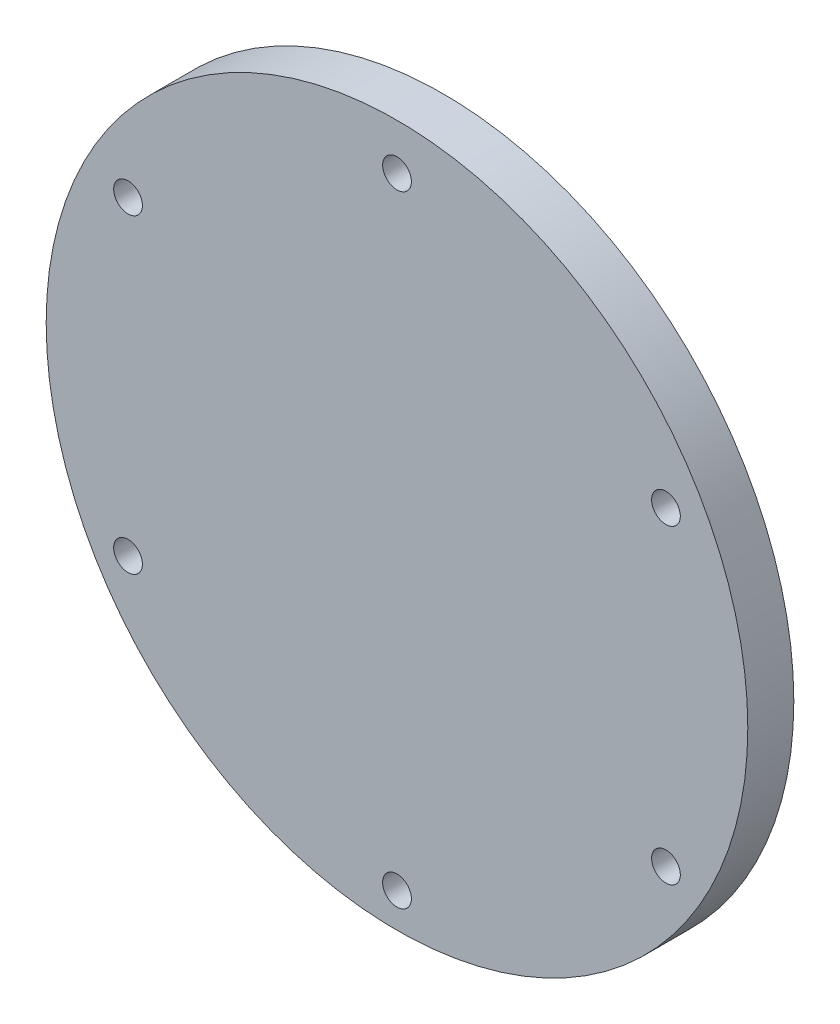
ISO-10303-21;
HEADER;
FILE_DESCRIPTION(('STEP AP214'),'2;1');
FILE_NAME('part.step','',(''),(''),'','','');
FILE_SCHEMA(('AUTOMOTIVE_DESIGN { 1 0 10303 214 1 1 1 1 }'));
ENDSEC;
DATA;
#1=APPLICATION_CONTEXT('core data for automotive mechanical design processes');
#2=APPLICATION_PROTOCOL_DEFINITION('international standard','automotive_design',2000,#1);
#3=PRODUCT_CONTEXT('',#1,'mechanical');
#4=PRODUCT('Part','Part','',(#3));
#5=PRODUCT_RELATED_PRODUCT_CATEGORY('part','',(#4));
#6=PRODUCT_DEFINITION_FORMATION('','',#4);
#7=PRODUCT_DEFINITION_CONTEXT('part definition',#1,'design');
#8=PRODUCT_DEFINITION('design','',#6,#7);
#9=PRODUCT_DEFINITION_SHAPE('','',#8);
#10=(LENGTH_UNIT() NAMED_UNIT(*) SI_UNIT(.MILLI.,.METRE.));
#11=(NAMED_UNIT(*) PLANE_ANGLE_UNIT() SI_UNIT($,.RADIAN.));
#12=(NAMED_UNIT(*) SI_UNIT($,.STERADIAN.) SOLID_ANGLE_UNIT());
#13=UNCERTAINTY_MEASURE_WITH_UNIT(LENGTH_MEASURE(1.E-05),#10,'distance_accuracy_value','');
#14=(GEOMETRIC_REPRESENTATION_CONTEXT(3) GLOBAL_UNCERTAINTY_ASSIGNED_CONTEXT((#13)) GLOBAL_UNIT_ASSIGNED_CONTEXT((#10,
#11,#12)) REPRESENTATION_CONTEXT('',''));
#15=CARTESIAN_POINT('',(0.,0.,0.));
#16=DIRECTION('',(0.,0.,1.));
#17=DIRECTION('',(1.,0.,0.));
#18=AXIS2_PLACEMENT_3D('',#15,#16,#17);
#19=CARTESIAN_POINT('',(-46.7653718043612,-27.0000000000027,8.));
#20=DIRECTION('',(0.,0.,-1.));
#21=DIRECTION('',(-1.,0.,0.));
#22=AXIS2_PLACEMENT_3D('',#19,#20,#21);
#23=CYLINDRICAL_SURFACE('',#22,2.50000000000083);
#24=CARTESIAN_POINT('',(-46.7653718043612,-27.0000000000027,8.));
#25=DIRECTION('',(0.,0.,1.));
#26=DIRECTION('',(1.,0.,0.));
#27=AXIS2_PLACEMENT_3D('',#24,#25,#26);
#28=CIRCLE('',#27,2.50000000000083);
#29=CARTESIAN_POINT('',(-44.2653718043604,-27.0000000000027,8.));
#30=VERTEX_POINT('',#29);
#31=EDGE_CURVE('E50',#30,#30,#28,.T.);
#32=ORIENTED_EDGE('',*,*,#31,.T.);
#33=EDGE_LOOP('',(#32));
#34=FACE_BOUND('',#33,.T.);
#35=CARTESIAN_POINT('',(-46.7653718043612,-27.0000000000027,0.));
#36=DIRECTION('',(0.,0.,1.));
#37=DIRECTION('',(1.,0.,0.));
#38=AXIS2_PLACEMENT_3D('',#35,#36,#37);
#39=CIRCLE('',#38,2.50000000000083);
#40=CARTESIAN_POINT('',(-44.2653718043604,-27.0000000000027,0.));
#41=VERTEX_POINT('',#40);
#42=EDGE_CURVE('E73',#41,#41,#39,.T.);
#43=ORIENTED_EDGE('',*,*,#42,.F.);
#44=EDGE_LOOP('',(#43));
#45=FACE_BOUND('',#44,.T.);
#46=ADVANCED_FACE('F42',(#34,#45),#23,.F.);
#47=CARTESIAN_POINT('',(-46.7653718043643,26.9999999999973,8.));
#48=DIRECTION('',(0.,0.,-1.));
#49=DIRECTION('',(-1.,0.,0.));
#50=AXIS2_PLACEMENT_3D('',#47,#48,#49);
#51=CYLINDRICAL_SURFACE('',#50,2.50000000000387);
#52=CARTESIAN_POINT('',(-46.7653718043643,26.9999999999973,8.));
#53=DIRECTION('',(0.,0.,1.));
#54=DIRECTION('',(1.,0.,0.));
#55=AXIS2_PLACEMENT_3D('',#52,#53,#54);
#56=CIRCLE('',#55,2.50000000000387);
#57=CARTESIAN_POINT('',(-44.2653718043604,26.9999999999973,8.));
#58=VERTEX_POINT('',#57);
#59=EDGE_CURVE('E55',#58,#58,#56,.T.);
#60=ORIENTED_EDGE('',*,*,#59,.T.);
#61=EDGE_LOOP('',(#60));
#62=FACE_BOUND('',#61,.T.);
#63=CARTESIAN_POINT('',(-46.7653718043643,26.9999999999973,0.));
#64=DIRECTION('',(0.,0.,1.));
#65=DIRECTION('',(1.,0.,0.));
#66=AXIS2_PLACEMENT_3D('',#63,#64,#65);
#67=CIRCLE('',#66,2.50000000000387);
#68=CARTESIAN_POINT('',(-44.2653718043604,26.9999999999973,0.));
#69=VERTEX_POINT('',#68);
#70=EDGE_CURVE('E71',#69,#69,#67,.T.);
#71=ORIENTED_EDGE('',*,*,#70,.F.);
#72=EDGE_LOOP('',(#71));
#73=FACE_BOUND('',#72,.T.);
#74=ADVANCED_FACE('F97',(#62,#73),#51,.F.);
#75=CARTESIAN_POINT('',(-6.12586305153647E-12,54.,8.));
#76=DIRECTION('',(0.,0.,-1.));
#77=DIRECTION('',(-1.,0.,0.));
#78=AXIS2_PLACEMENT_3D('',#75,#76,#77);
#79=CYLINDRICAL_SURFACE('',#78,2.50000000000622);
#80=CARTESIAN_POINT('',(-6.12586305153647E-12,54.,8.));
#81=DIRECTION('',(0.,0.,1.));
#82=DIRECTION('',(1.,0.,0.));
#83=AXIS2_PLACEMENT_3D('',#80,#81,#82);
#84=CIRCLE('',#83,2.50000000000622);
#85=CARTESIAN_POINT('',(2.50000000000009,54.,8.));
#86=VERTEX_POINT('',#85);
#87=EDGE_CURVE('E92',#86,#86,#84,.T.);
#88=ORIENTED_EDGE('',*,*,#87,.T.);
#89=EDGE_LOOP('',(#88));
#90=FACE_BOUND('',#89,.T.);
#91=CARTESIAN_POINT('',(-6.12586305153647E-12,54.,0.));
#92=DIRECTION('',(0.,0.,1.));
#93=DIRECTION('',(1.,0.,0.));
#94=AXIS2_PLACEMENT_3D('',#91,#92,#93);
#95=CIRCLE('',#94,2.50000000000622);
#96=CARTESIAN_POINT('',(2.50000000000009,54.,0.));
#97=VERTEX_POINT('',#96);
#98=EDGE_CURVE('E68',#97,#97,#95,.T.);
#99=ORIENTED_EDGE('',*,*,#98,.F.);
#100=EDGE_LOOP('',(#99));
#101=FACE_BOUND('',#100,.T.);
#102=ADVANCED_FACE('F115',(#90,#101),#79,.F.);
#103=CARTESIAN_POINT('',(46.7653718043551,27.0000000000027,8.));
#104=DIRECTION('',(0.,0.,-1.));
#105=DIRECTION('',(-1.,0.,0.));
#106=AXIS2_PLACEMENT_3D('',#103,#104,#105);
#107=CYLINDRICAL_SURFACE('',#106,2.50000000000566);
#108=CARTESIAN_POINT('',(46.7653718043551,27.0000000000027,8.));
#109=DIRECTION('',(0.,0.,1.));
#110=DIRECTION('',(1.,0.,0.));
#111=AXIS2_PLACEMENT_3D('',#108,#109,#110);
#112=CIRCLE('',#111,2.50000000000566);
#113=CARTESIAN_POINT('',(49.2653718043607,27.0000000000027,8.));
#114=VERTEX_POINT('',#113);
#115=EDGE_CURVE('E87',#114,#114,#112,.T.);
#116=ORIENTED_EDGE('',*,*,#115,.T.);
#117=EDGE_LOOP('',(#116));
#118=FACE_BOUND('',#117,.T.);
#119=CARTESIAN_POINT('',(46.7653718043551,27.0000000000027,0.));
#120=DIRECTION('',(0.,0.,1.));
#121=DIRECTION('',(1.,0.,0.));
#122=AXIS2_PLACEMENT_3D('',#119,#120,#121);
#123=CIRCLE('',#122,2.50000000000566);
#124=CARTESIAN_POINT('',(49.2653718043607,27.0000000000027,0.));
#125=VERTEX_POINT('',#124);
#126=EDGE_CURVE('E65',#125,#125,#123,.T.);
#127=ORIENTED_EDGE('',*,*,#126,.F.);
#128=EDGE_LOOP('',(#127));
#129=FACE_BOUND('',#128,.T.);
#130=ADVANCED_FACE('F122',(#118,#129),#107,.F.);
#131=CARTESIAN_POINT('',(46.7653718043582,-26.9999999999973,8.));
#132=DIRECTION('',(0.,0.,-1.));
#133=DIRECTION('',(-1.,0.,0.));
#134=AXIS2_PLACEMENT_3D('',#131,#132,#133);
#135=CYLINDRICAL_SURFACE('',#134,2.50000000000288);
#136=CARTESIAN_POINT('',(46.7653718043582,-26.9999999999973,8.));
#137=DIRECTION('',(0.,0.,1.));
#138=DIRECTION('',(1.,0.,0.));
#139=AXIS2_PLACEMENT_3D('',#136,#137,#138);
#140=CIRCLE('',#139,2.50000000000288);
#141=CARTESIAN_POINT('',(49.2653718043611,-26.9999999999973,8.));
#142=VERTEX_POINT('',#141);
#143=EDGE_CURVE('E82',#142,#142,#140,.T.);
#144=ORIENTED_EDGE('',*,*,#143,.T.);
#145=EDGE_LOOP('',(#144));
#146=FACE_BOUND('',#145,.T.);
#147=CARTESIAN_POINT('',(46.7653718043582,-26.9999999999973,0.));
#148=DIRECTION('',(0.,0.,1.));
#149=DIRECTION('',(1.,0.,0.));
#150=AXIS2_PLACEMENT_3D('',#147,#148,#149);
#151=CIRCLE('',#150,2.50000000000288);
#152=CARTESIAN_POINT('',(49.2653718043611,-26.9999999999973,0.));
#153=VERTEX_POINT('',#152);
#154=EDGE_CURVE('E62',#153,#153,#151,.T.);
#155=ORIENTED_EDGE('',*,*,#154,.F.);
#156=EDGE_LOOP('',(#155));
#157=FACE_BOUND('',#156,.T.);
#158=ADVANCED_FACE('F125',(#146,#157),#135,.F.);
#159=CARTESIAN_POINT('',(0.,-54.,8.));
#160=DIRECTION('',(0.,0.,-1.));
#161=DIRECTION('',(-1.,0.,0.));
#162=AXIS2_PLACEMENT_3D('',#159,#160,#161);
#163=CYLINDRICAL_SURFACE('',#162,2.5);
#164=CARTESIAN_POINT('',(0.,-54.,8.));
#165=DIRECTION('',(0.,0.,1.));
#166=DIRECTION('',(1.,0.,0.));
#167=AXIS2_PLACEMENT_3D('',#164,#165,#166);
#168=CIRCLE('',#167,2.5);
#169=CARTESIAN_POINT('',(2.5,-54.,8.));
#170=VERTEX_POINT('',#169);
#171=EDGE_CURVE('E78',#170,#170,#168,.T.);
#172=ORIENTED_EDGE('',*,*,#171,.T.);
#173=EDGE_LOOP('',(#172));
#174=FACE_BOUND('',#173,.T.);
#175=CARTESIAN_POINT('',(0.,-54.,0.));
#176=DIRECTION('',(0.,0.,1.));
#177=DIRECTION('',(1.,0.,0.));
#178=AXIS2_PLACEMENT_3D('',#175,#176,#177);
#179=CIRCLE('',#178,2.5);
#180=CARTESIAN_POINT('',(2.5,-54.,0.));
#181=VERTEX_POINT('',#180);
#182=EDGE_CURVE('E59',#181,#181,#179,.T.);
#183=ORIENTED_EDGE('',*,*,#182,.F.);
#184=EDGE_LOOP('',(#183));
#185=FACE_BOUND('',#184,.T.);
#186=ADVANCED_FACE('F44',(#174,#185),#163,.F.);
#187=CARTESIAN_POINT('',(0.,1.,8.));
#188=DIRECTION('',(0.,0.,-1.));
#189=DIRECTION('',(-1.,0.,0.));
#190=AXIS2_PLACEMENT_3D('',#187,#188,#189);
#191=CYLINDRICAL_SURFACE('',#190,61.);
#192=CARTESIAN_POINT('',(0.,1.,8.));
#193=DIRECTION('',(0.,0.,1.));
#194=DIRECTION('',(1.,0.,0.));
#195=AXIS2_PLACEMENT_3D('',#192,#193,#194);
#196=CIRCLE('',#195,61.);
#197=CARTESIAN_POINT('',(61.,1.,8.));
#198=VERTEX_POINT('',#197);
#199=EDGE_CURVE('E12',#198,#198,#196,.T.);
#200=ORIENTED_EDGE('',*,*,#199,.F.);
#201=EDGE_LOOP('',(#200));
#202=FACE_BOUND('',#201,.T.);
#203=CARTESIAN_POINT('',(0.,1.,0.));
#204=DIRECTION('',(0.,0.,1.));
#205=DIRECTION('',(1.,0.,0.));
#206=AXIS2_PLACEMENT_3D('',#203,#204,#205);
#207=CIRCLE('',#206,61.);
#208=CARTESIAN_POINT('',(61.,1.,0.));
#209=VERTEX_POINT('',#208);
#210=EDGE_CURVE('E46',#209,#209,#207,.T.);
#211=ORIENTED_EDGE('',*,*,#210,.T.);
#212=EDGE_LOOP('',(#211));
#213=FACE_BOUND('',#212,.T.);
#214=ADVANCED_FACE('F104',(#202,#213),#191,.T.);
#215=CARTESIAN_POINT('',(0.,0.,8.));
#216=DIRECTION('',(0.,0.,1.));
#217=DIRECTION('',(1.,0.,0.));
#218=AXIS2_PLACEMENT_3D('',#215,#216,#217);
#219=PLANE('',#218);
#220=ORIENTED_EDGE('',*,*,#171,.F.);
#221=EDGE_LOOP('',(#220));
#222=FACE_BOUND('',#221,.T.);
#223=ORIENTED_EDGE('',*,*,#143,.F.);
#224=EDGE_LOOP('',(#223));
#225=FACE_BOUND('',#224,.T.);
#226=ORIENTED_EDGE('',*,*,#115,.F.);
#227=EDGE_LOOP('',(#226));
#228=FACE_BOUND('',#227,.T.);
#229=ORIENTED_EDGE('',*,*,#87,.F.);
#230=EDGE_LOOP('',(#229));
#231=FACE_BOUND('',#230,.T.);
#232=ORIENTED_EDGE('',*,*,#59,.F.);
#233=EDGE_LOOP('',(#232));
#234=FACE_BOUND('',#233,.T.);
#235=ORIENTED_EDGE('',*,*,#31,.F.);
#236=EDGE_LOOP('',(#235));
#237=FACE_BOUND('',#236,.T.);
#238=ORIENTED_EDGE('',*,*,#199,.T.);
#239=EDGE_LOOP('',(#238));
#240=FACE_BOUND('',#239,.T.);
#241=ADVANCED_FACE('F100',(#222,#225,#228,#231,#234,#237,#240),#219,.T.);
#242=CARTESIAN_POINT('',(0.,0.,0.));
#243=DIRECTION('',(0.,0.,1.));
#244=DIRECTION('',(1.,0.,0.));
#245=AXIS2_PLACEMENT_3D('',#242,#243,#244);
#246=PLANE('',#245);
#247=ORIENTED_EDGE('',*,*,#182,.T.);
#248=EDGE_LOOP('',(#247));
#249=FACE_BOUND('',#248,.T.);
#250=ORIENTED_EDGE('',*,*,#154,.T.);
#251=EDGE_LOOP('',(#250));
#252=FACE_BOUND('',#251,.T.);
#253=ORIENTED_EDGE('',*,*,#126,.T.);
#254=EDGE_LOOP('',(#253));
#255=FACE_BOUND('',#254,.T.);
#256=ORIENTED_EDGE('',*,*,#98,.T.);
#257=EDGE_LOOP('',(#256));
#258=FACE_BOUND('',#257,.T.);
#259=ORIENTED_EDGE('',*,*,#70,.T.);
#260=EDGE_LOOP('',(#259));
#261=FACE_BOUND('',#260,.T.);
#262=ORIENTED_EDGE('',*,*,#42,.T.);
#263=EDGE_LOOP('',(#262));
#264=FACE_BOUND('',#263,.T.);
#265=ORIENTED_EDGE('',*,*,#210,.F.);
#266=EDGE_LOOP('',(#265));
#267=FACE_BOUND('',#266,.T.);
#268=ADVANCED_FACE('F103',(#249,#252,#255,#258,#261,#264,#267),#246,.F.);
#269=CLOSED_SHELL('',(#46,#74,#102,#130,#158,#186,#214,#241,#268));
#270=MANIFOLD_SOLID_BREP('B2',#269);
#271=ADVANCED_BREP_SHAPE_REPRESENTATION('',(#18,#270),#14);
#272=SHAPE_DEFINITION_REPRESENTATION(#9,#271);
ENDSEC;
END-ISO-10303-21;
